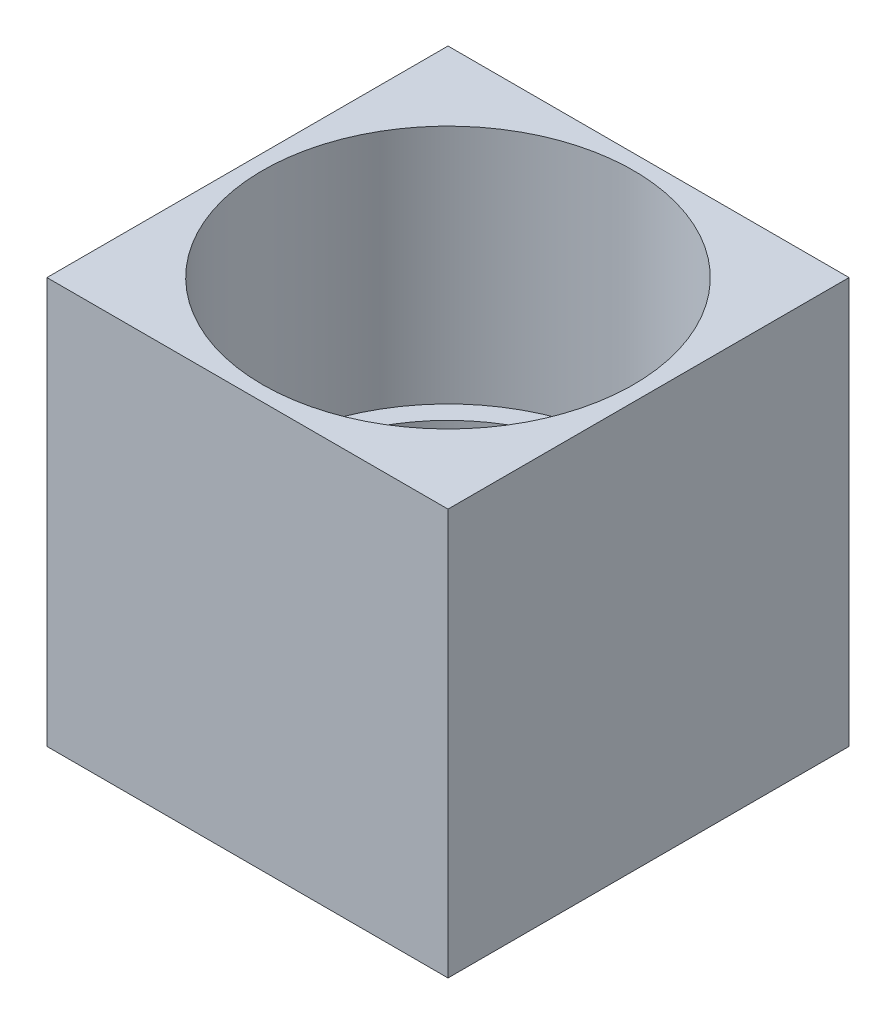
ISO-10303-21;
HEADER;
FILE_DESCRIPTION(('STEP AP214'),'2;1');
FILE_NAME('part.step','',(''),(''),'','','');
FILE_SCHEMA(('AUTOMOTIVE_DESIGN { 1 0 10303 214 1 1 1 1 }'));
ENDSEC;
DATA;
#1=APPLICATION_CONTEXT('core data for automotive mechanical design processes');
#2=APPLICATION_PROTOCOL_DEFINITION('international standard','automotive_design',2000,#1);
#3=PRODUCT_CONTEXT('',#1,'mechanical');
#4=PRODUCT('Part','Part','',(#3));
#5=PRODUCT_RELATED_PRODUCT_CATEGORY('part','',(#4));
#6=PRODUCT_DEFINITION_FORMATION('','',#4);
#7=PRODUCT_DEFINITION_CONTEXT('part definition',#1,'design');
#8=PRODUCT_DEFINITION('design','',#6,#7);
#9=PRODUCT_DEFINITION_SHAPE('','',#8);
#10=(LENGTH_UNIT() NAMED_UNIT(*) SI_UNIT(.MILLI.,.METRE.));
#11=(NAMED_UNIT(*) PLANE_ANGLE_UNIT() SI_UNIT($,.RADIAN.));
#12=(NAMED_UNIT(*) SI_UNIT($,.STERADIAN.) SOLID_ANGLE_UNIT());
#13=UNCERTAINTY_MEASURE_WITH_UNIT(LENGTH_MEASURE(1.E-05),#10,'distance_accuracy_value','');
#14=(GEOMETRIC_REPRESENTATION_CONTEXT(3) GLOBAL_UNCERTAINTY_ASSIGNED_CONTEXT((#13)) GLOBAL_UNIT_ASSIGNED_CONTEXT((#10,
#11,#12)) REPRESENTATION_CONTEXT('',''));
#15=CARTESIAN_POINT('',(0.,0.,0.));
#16=DIRECTION('',(0.,0.,1.));
#17=DIRECTION('',(1.,0.,0.));
#18=AXIS2_PLACEMENT_3D('',#15,#16,#17);
#19=CARTESIAN_POINT('',(0.,4.,0.));
#20=DIRECTION('',(0.,1.,0.));
#21=DIRECTION('',(0.,0.,1.));
#22=AXIS2_PLACEMENT_3D('',#19,#20,#21);
#23=CYLINDRICAL_SURFACE('',#22,16.5);
#24=CARTESIAN_POINT('',(0.,45.,0.));
#25=DIRECTION('',(0.,1.,0.));
#26=DIRECTION('',(0.,0.,1.));
#27=AXIS2_PLACEMENT_3D('',#24,#25,#26);
#28=CIRCLE('',#27,16.5);
#29=CARTESIAN_POINT('',(0.,45.,16.5));
#30=VERTEX_POINT('',#29);
#31=EDGE_CURVE('E119',#30,#30,#28,.T.);
#32=ORIENTED_EDGE('',*,*,#31,.T.);
#33=EDGE_LOOP('',(#32));
#34=FACE_BOUND('',#33,.T.);
#35=CARTESIAN_POINT('',(0.,28.5,0.));
#36=DIRECTION('',(0.,-1.,0.));
#37=DIRECTION('',(0.,0.,-1.));
#38=AXIS2_PLACEMENT_3D('',#35,#36,#37);
#39=CIRCLE('',#38,16.5);
#40=CARTESIAN_POINT('',(0.,28.5,-16.5));
#41=VERTEX_POINT('',#40);
#42=EDGE_CURVE('E113',#41,#41,#39,.F.);
#43=ORIENTED_EDGE('',*,*,#42,.F.);
#44=EDGE_LOOP('',(#43));
#45=FACE_BOUND('',#44,.T.);
#46=ADVANCED_FACE('F43',(#34,#45),#23,.F.);
#47=CARTESIAN_POINT('',(-20.,90.,20.));
#48=DIRECTION('',(1.,0.,0.));
#49=DIRECTION('',(0.,0.,-1.));
#50=AXIS2_PLACEMENT_3D('',#47,#48,#49);
#51=PLANE('',#50);
#52=DIRECTION('',(0.,0.,1.));
#53=VECTOR('',#52,1.);
#54=CARTESIAN_POINT('',(-20.0000000000002,28.5,-20.));
#55=LINE('',#54,#53);
#56=CARTESIAN_POINT('',(-20.,28.5,-20.));
#57=VERTEX_POINT('',#56);
#58=CARTESIAN_POINT('',(-20.0000000000002,28.5,20.));
#59=VERTEX_POINT('',#58);
#60=EDGE_CURVE('E60',#57,#59,#55,.T.);
#61=ORIENTED_EDGE('',*,*,#60,.T.);
#62=DIRECTION('',(0.,-1.,0.));
#63=VECTOR('',#62,1.);
#64=CARTESIAN_POINT('',(-20.,90.,20.));
#65=LINE('',#64,#63);
#66=CARTESIAN_POINT('',(-20.,69.,20.));
#67=VERTEX_POINT('',#66);
#68=EDGE_CURVE('E129',#67,#59,#65,.T.);
#69=ORIENTED_EDGE('',*,*,#68,.F.);
#70=DIRECTION('',(0.,0.,1.));
#71=VECTOR('',#70,1.);
#72=CARTESIAN_POINT('',(-20.,69.,20.));
#73=LINE('',#72,#71);
#74=CARTESIAN_POINT('',(-20.,69.,-20.));
#75=VERTEX_POINT('',#74);
#76=EDGE_CURVE('E68',#75,#67,#73,.T.);
#77=ORIENTED_EDGE('',*,*,#76,.F.);
#78=DIRECTION('',(0.,-1.,0.));
#79=VECTOR('',#78,1.);
#80=CARTESIAN_POINT('',(-20.,90.,-20.));
#81=LINE('',#80,#79);
#82=EDGE_CURVE('E53',#75,#57,#81,.T.);
#83=ORIENTED_EDGE('',*,*,#82,.T.);
#84=EDGE_LOOP('',(#61,#69,#77,#83));
#85=FACE_BOUND('',#84,.T.);
#86=ADVANCED_FACE('F135',(#85),#51,.F.);
#87=CARTESIAN_POINT('',(20.,90.,20.));
#88=DIRECTION('',(-1.,0.,0.));
#89=DIRECTION('',(0.,0.,1.));
#90=AXIS2_PLACEMENT_3D('',#87,#88,#89);
#91=PLANE('',#90);
#92=DIRECTION('',(0.,0.,1.));
#93=VECTOR('',#92,1.);
#94=CARTESIAN_POINT('',(20.,28.5,-20.));
#95=LINE('',#94,#93);
#96=CARTESIAN_POINT('',(20.,28.5,-20.));
#97=VERTEX_POINT('',#96);
#98=CARTESIAN_POINT('',(20.,28.5,20.));
#99=VERTEX_POINT('',#98);
#100=EDGE_CURVE('E87',#97,#99,#95,.T.);
#101=ORIENTED_EDGE('',*,*,#100,.F.);
#102=DIRECTION('',(0.,-1.,0.));
#103=VECTOR('',#102,1.);
#104=CARTESIAN_POINT('',(20.,90.,-20.));
#105=LINE('',#104,#103);
#106=CARTESIAN_POINT('',(20.,69.,-20.));
#107=VERTEX_POINT('',#106);
#108=EDGE_CURVE('E11',#107,#97,#105,.T.);
#109=ORIENTED_EDGE('',*,*,#108,.F.);
#110=DIRECTION('',(0.,0.,-1.));
#111=VECTOR('',#110,1.);
#112=CARTESIAN_POINT('',(20.,69.,20.));
#113=LINE('',#112,#111);
#114=CARTESIAN_POINT('',(20.,69.,20.));
#115=VERTEX_POINT('',#114);
#116=EDGE_CURVE('E107',#115,#107,#113,.T.);
#117=ORIENTED_EDGE('',*,*,#116,.F.);
#118=DIRECTION('',(0.,-1.,0.));
#119=VECTOR('',#118,1.);
#120=CARTESIAN_POINT('',(20.,90.,20.));
#121=LINE('',#120,#119);
#122=EDGE_CURVE('E100',#115,#99,#121,.T.);
#123=ORIENTED_EDGE('',*,*,#122,.T.);
#124=EDGE_LOOP('',(#101,#109,#117,#123));
#125=FACE_BOUND('',#124,.T.);
#126=ADVANCED_FACE('F45',(#125),#91,.F.);
#127=CARTESIAN_POINT('',(-20.,90.,20.));
#128=DIRECTION('',(0.,0.,-1.));
#129=DIRECTION('',(-1.,0.,0.));
#130=AXIS2_PLACEMENT_3D('',#127,#128,#129);
#131=PLANE('',#130);
#132=DIRECTION('',(1.,0.,0.));
#133=VECTOR('',#132,1.);
#134=CARTESIAN_POINT('',(-20.0000000000002,28.5,20.));
#135=LINE('',#134,#133);
#136=EDGE_CURVE('E93',#59,#99,#135,.T.);
#137=ORIENTED_EDGE('',*,*,#136,.T.);
#138=ORIENTED_EDGE('',*,*,#122,.F.);
#139=DIRECTION('',(1.,0.,0.));
#140=VECTOR('',#139,1.);
#141=CARTESIAN_POINT('',(-20.,69.,20.));
#142=LINE('',#141,#140);
#143=EDGE_CURVE('E111',#67,#115,#142,.T.);
#144=ORIENTED_EDGE('',*,*,#143,.F.);
#145=ORIENTED_EDGE('',*,*,#68,.T.);
#146=EDGE_LOOP('',(#137,#138,#144,#145));
#147=FACE_BOUND('',#146,.T.);
#148=ADVANCED_FACE('F138',(#147),#131,.F.);
#149=CARTESIAN_POINT('',(-20.,90.,-20.));
#150=DIRECTION('',(0.,0.,1.));
#151=DIRECTION('',(1.,0.,0.));
#152=AXIS2_PLACEMENT_3D('',#149,#150,#151);
#153=PLANE('',#152);
#154=DIRECTION('',(1.,0.,0.));
#155=VECTOR('',#154,1.);
#156=CARTESIAN_POINT('',(-20.0000000000002,28.5,-20.));
#157=LINE('',#156,#155);
#158=EDGE_CURVE('E83',#57,#97,#157,.T.);
#159=ORIENTED_EDGE('',*,*,#158,.F.);
#160=ORIENTED_EDGE('',*,*,#82,.F.);
#161=DIRECTION('',(-1.,0.,0.));
#162=VECTOR('',#161,1.);
#163=CARTESIAN_POINT('',(-20.,69.,-20.));
#164=LINE('',#163,#162);
#165=EDGE_CURVE('E105',#107,#75,#164,.T.);
#166=ORIENTED_EDGE('',*,*,#165,.F.);
#167=ORIENTED_EDGE('',*,*,#108,.T.);
#168=EDGE_LOOP('',(#159,#160,#166,#167));
#169=FACE_BOUND('',#168,.T.);
#170=ADVANCED_FACE('F104',(#169),#153,.F.);
#171=CARTESIAN_POINT('',(0.,45.,0.));
#172=DIRECTION('',(0.,1.,0.));
#173=DIRECTION('',(0.,0.,1.));
#174=AXIS2_PLACEMENT_3D('',#171,#172,#173);
#175=CYLINDRICAL_SURFACE('',#174,18.5);
#176=CARTESIAN_POINT('',(0.,69.,0.));
#177=DIRECTION('',(0.,-1.,0.));
#178=DIRECTION('',(0.,0.,-1.));
#179=AXIS2_PLACEMENT_3D('',#176,#177,#178);
#180=CIRCLE('',#179,18.5);
#181=CARTESIAN_POINT('',(0.,69.,18.5));
#182=VERTEX_POINT('',#181);
#183=EDGE_CURVE('E47',#182,#182,#180,.F.);
#184=CARTESIAN_POINT('',(0.,45.,0.));
#185=DIRECTION('',(0.,1.,0.));
#186=DIRECTION('',(0.,0.,1.));
#187=AXIS2_PLACEMENT_3D('',#184,#185,#186);
#188=CIRCLE('',#187,18.5);
#189=CARTESIAN_POINT('',(0.,45.,18.5));
#190=VERTEX_POINT('',#189);
#191=EDGE_CURVE('E123',#190,#190,#188,.T.);
#192=CARTESIAN_POINT('',(0.,69.,18.5));
#193=CARTESIAN_POINT('',(0.,68.75,18.5));
#194=CARTESIAN_POINT('',(0.,68.5,18.5));
#195=CARTESIAN_POINT('',(0.,68.,18.5));
#196=CARTESIAN_POINT('',(0.,67.75,18.5));
#197=CARTESIAN_POINT('',(0.,67.25,18.5));
#198=CARTESIAN_POINT('',(0.,67.,18.5));
#199=CARTESIAN_POINT('',(0.,66.5,18.5));
#200=CARTESIAN_POINT('',(0.,66.25,18.5));
#201=CARTESIAN_POINT('',(0.,65.75,18.5));
#202=CARTESIAN_POINT('',(0.,65.5,18.5));
#203=CARTESIAN_POINT('',(0.,65.,18.5));
#204=CARTESIAN_POINT('',(0.,64.75,18.5));
#205=CARTESIAN_POINT('',(0.,64.25,18.5));
#206=CARTESIAN_POINT('',(0.,64.,18.5));
#207=CARTESIAN_POINT('',(0.,63.5,18.5));
#208=CARTESIAN_POINT('',(0.,63.25,18.5));
#209=CARTESIAN_POINT('',(0.,62.75,18.5));
#210=CARTESIAN_POINT('',(0.,62.5,18.5));
#211=CARTESIAN_POINT('',(0.,62.,18.5));
#212=CARTESIAN_POINT('',(0.,61.75,18.5));
#213=CARTESIAN_POINT('',(0.,61.25,18.5));
#214=CARTESIAN_POINT('',(0.,61.,18.5));
#215=CARTESIAN_POINT('',(0.,60.5,18.5));
#216=CARTESIAN_POINT('',(0.,60.25,18.5));
#217=CARTESIAN_POINT('',(0.,59.75,18.5));
#218=CARTESIAN_POINT('',(0.,59.5,18.5));
#219=CARTESIAN_POINT('',(0.,59.,18.5));
#220=CARTESIAN_POINT('',(0.,58.75,18.5));
#221=CARTESIAN_POINT('',(0.,58.25,18.5));
#222=CARTESIAN_POINT('',(0.,58.,18.5));
#223=CARTESIAN_POINT('',(0.,57.5,18.5));
#224=CARTESIAN_POINT('',(0.,57.25,18.5));
#225=CARTESIAN_POINT('',(0.,56.75,18.5));
#226=CARTESIAN_POINT('',(0.,56.5,18.5));
#227=CARTESIAN_POINT('',(0.,56.,18.5));
#228=CARTESIAN_POINT('',(0.,55.75,18.5));
#229=CARTESIAN_POINT('',(0.,55.25,18.5));
#230=CARTESIAN_POINT('',(0.,55.,18.5));
#231=CARTESIAN_POINT('',(0.,54.5,18.5));
#232=CARTESIAN_POINT('',(0.,54.25,18.5));
#233=CARTESIAN_POINT('',(0.,53.75,18.5));
#234=CARTESIAN_POINT('',(0.,53.5,18.5));
#235=CARTESIAN_POINT('',(0.,53.,18.5));
#236=CARTESIAN_POINT('',(0.,52.75,18.5));
#237=CARTESIAN_POINT('',(0.,52.25,18.5));
#238=CARTESIAN_POINT('',(0.,52.,18.5));
#239=CARTESIAN_POINT('',(0.,51.5,18.5));
#240=CARTESIAN_POINT('',(0.,51.25,18.5));
#241=CARTESIAN_POINT('',(0.,50.75,18.5));
#242=CARTESIAN_POINT('',(0.,50.5,18.5));
#243=CARTESIAN_POINT('',(0.,50.,18.5));
#244=CARTESIAN_POINT('',(0.,49.75,18.5));
#245=CARTESIAN_POINT('',(0.,49.25,18.5));
#246=CARTESIAN_POINT('',(0.,49.,18.5));
#247=CARTESIAN_POINT('',(0.,48.5,18.5));
#248=CARTESIAN_POINT('',(0.,48.25,18.5));
#249=CARTESIAN_POINT('',(0.,47.75,18.5));
#250=CARTESIAN_POINT('',(0.,47.5,18.5));
#251=CARTESIAN_POINT('',(0.,47.,18.5));
#252=CARTESIAN_POINT('',(0.,46.75,18.5));
#253=CARTESIAN_POINT('',(0.,46.25,18.5));
#254=CARTESIAN_POINT('',(0.,46.,18.5));
#255=CARTESIAN_POINT('',(0.,45.5,18.5));
#256=CARTESIAN_POINT('',(0.,45.25,18.5));
#257=CARTESIAN_POINT('',(0.,45.,18.5));
#258=B_SPLINE_CURVE_WITH_KNOTS('',3,(#192,#193,#194,#195,#196,#197,#198,#199,#200,#201,#202,
#203,#204,#205,#206,#207,#208,#209,#210,#211,#212,#213,#214,#215,#216,#217,#218,#219,#220,#221,
#222,#223,#224,#225,#226,#227,#228,#229,#230,#231,#232,#233,#234,#235,#236,#237,#238,#239,#240,
#241,#242,#243,#244,#245,#246,#247,#248,#249,#250,#251,#252,#253,#254,#255,#256,#257),
.UNSPECIFIED.,.F.,.F.,(4,2,2,2,2,2,2,2,2,2,2,2,2,2,2,2,2,2,2,2,2,2,2,2,2,2,2,2,2,2,2,2,4),(0.,
0.750000000000001,1.5,2.25,2.99999999999999,3.74999999999999,4.49999999999999,5.24999999999999,
5.99999999999999,6.74999999999999,7.49999999999999,8.24999999999999,8.99999999999999,
9.74999999999999,10.5,11.25,12.,12.75,13.5,14.25,15.,15.75,16.5,17.25,18.,18.75,19.5,20.25,21.,
21.75,22.5,23.25,24.),.UNSPECIFIED.);
#259=EDGE_CURVE('BSEAM148',#182,#190,#258,.T.);
#260=ORIENTED_EDGE('',*,*,#183,.T.);
#261=ORIENTED_EDGE('',*,*,#191,.F.);
#262=ORIENTED_EDGE('',*,*,#259,.T.);
#263=ORIENTED_EDGE('',*,*,#259,.F.);
#264=EDGE_LOOP('',(#260,#262,#261,#263));
#265=FACE_BOUND('',#264,.T.);
#266=ADVANCED_FACE('F148',(#265),#175,.F.);
#267=CARTESIAN_POINT('',(0.,45.,0.));
#268=DIRECTION('',(0.,1.,0.));
#269=DIRECTION('',(0.,0.,1.));
#270=AXIS2_PLACEMENT_3D('',#267,#268,#269);
#271=PLANE('',#270);
#272=ORIENTED_EDGE('',*,*,#31,.F.);
#273=EDGE_LOOP('',(#272));
#274=FACE_BOUND('',#273,.T.);
#275=ORIENTED_EDGE('',*,*,#191,.T.);
#276=EDGE_LOOP('',(#275));
#277=FACE_BOUND('',#276,.T.);
#278=ADVANCED_FACE('F142',(#274,#277),#271,.T.);
#279=CARTESIAN_POINT('',(0.,69.,0.));
#280=DIRECTION('',(0.,-1.,0.));
#281=DIRECTION('',(0.,0.,-1.));
#282=AXIS2_PLACEMENT_3D('',#279,#280,#281);
#283=PLANE('',#282);
#284=ORIENTED_EDGE('',*,*,#116,.T.);
#285=ORIENTED_EDGE('',*,*,#165,.T.);
#286=ORIENTED_EDGE('',*,*,#76,.T.);
#287=ORIENTED_EDGE('',*,*,#143,.T.);
#288=EDGE_LOOP('',(#284,#285,#286,#287));
#289=FACE_BOUND('',#288,.T.);
#290=ORIENTED_EDGE('',*,*,#183,.F.);
#291=EDGE_LOOP('',(#290));
#292=FACE_BOUND('',#291,.T.);
#293=ADVANCED_FACE('F139',(#289,#292),#283,.F.);
#294=CARTESIAN_POINT('',(-20.0000000000002,28.5,-20.));
#295=DIRECTION('',(0.,-1.,0.));
#296=DIRECTION('',(0.,0.,-1.));
#297=AXIS2_PLACEMENT_3D('',#294,#295,#296);
#298=PLANE('',#297);
#299=ORIENTED_EDGE('',*,*,#136,.F.);
#300=ORIENTED_EDGE('',*,*,#60,.F.);
#301=ORIENTED_EDGE('',*,*,#158,.T.);
#302=ORIENTED_EDGE('',*,*,#100,.T.);
#303=EDGE_LOOP('',(#299,#300,#301,#302));
#304=FACE_BOUND('',#303,.T.);
#305=ORIENTED_EDGE('',*,*,#42,.T.);
#306=EDGE_LOOP('',(#305));
#307=FACE_BOUND('',#306,.T.);
#308=ADVANCED_FACE('F85',(#304,#307),#298,.T.);
#309=CLOSED_SHELL('',(#46,#86,#126,#148,#170,#266,#278,#293,#308));
#310=MANIFOLD_SOLID_BREP('B2',#309);
#311=ADVANCED_BREP_SHAPE_REPRESENTATION('',(#18,#310),#14);
#312=SHAPE_DEFINITION_REPRESENTATION(#9,#311);
ENDSEC;
END-ISO-10303-21;
